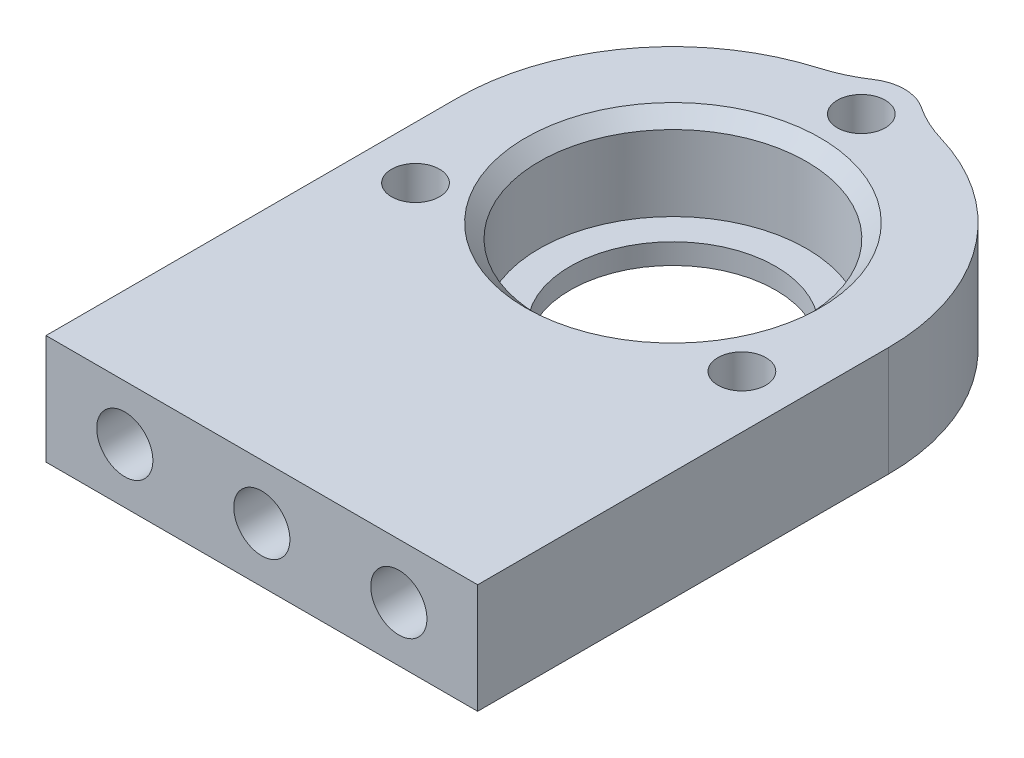
ISO-10303-21;
HEADER;
FILE_DESCRIPTION(('STEP AP214'),'2;1');
FILE_NAME('part.step','',(''),(''),'','','');
FILE_SCHEMA(('AUTOMOTIVE_DESIGN { 1 0 10303 214 1 1 1 1 }'));
ENDSEC;
DATA;
#1=APPLICATION_CONTEXT('core data for automotive mechanical design processes');
#2=APPLICATION_PROTOCOL_DEFINITION('international standard','automotive_design',2000,#1);
#3=PRODUCT_CONTEXT('',#1,'mechanical');
#4=PRODUCT('Part','Part','',(#3));
#5=PRODUCT_RELATED_PRODUCT_CATEGORY('part','',(#4));
#6=PRODUCT_DEFINITION_FORMATION('','',#4);
#7=PRODUCT_DEFINITION_CONTEXT('part definition',#1,'design');
#8=PRODUCT_DEFINITION('design','',#6,#7);
#9=PRODUCT_DEFINITION_SHAPE('','',#8);
#10=(LENGTH_UNIT() NAMED_UNIT(*) SI_UNIT(.MILLI.,.METRE.));
#11=(NAMED_UNIT(*) PLANE_ANGLE_UNIT() SI_UNIT($,.RADIAN.));
#12=(NAMED_UNIT(*) SI_UNIT($,.STERADIAN.) SOLID_ANGLE_UNIT());
#13=UNCERTAINTY_MEASURE_WITH_UNIT(LENGTH_MEASURE(1.E-05),#10,'distance_accuracy_value','');
#14=(GEOMETRIC_REPRESENTATION_CONTEXT(3) GLOBAL_UNCERTAINTY_ASSIGNED_CONTEXT((#13)) GLOBAL_UNIT_ASSIGNED_CONTEXT((#10,
#11,#12)) REPRESENTATION_CONTEXT('',''));
#15=CARTESIAN_POINT('',(0.,0.,0.));
#16=DIRECTION('',(0.,0.,1.));
#17=DIRECTION('',(1.,0.,0.));
#18=AXIS2_PLACEMENT_3D('',#15,#16,#17);
#19=CARTESIAN_POINT('',(0.,8.,-30.));
#20=DIRECTION('',(0.,-1.,0.));
#21=DIRECTION('',(0.,0.,-1.));
#22=AXIS2_PLACEMENT_3D('',#19,#20,#21);
#23=CYLINDRICAL_SURFACE('',#22,15.75);
#24=CARTESIAN_POINT('',(0.,0.,-30.));
#25=DIRECTION('',(0.,1.,0.));
#26=DIRECTION('',(0.,0.,1.));
#27=AXIS2_PLACEMENT_3D('',#24,#25,#26);
#28=CIRCLE('',#27,15.75);
#29=CARTESIAN_POINT('',(15.75,0.,-30.));
#30=VERTEX_POINT('',#29);
#31=CARTESIAN_POINT('',(4.45531118731971,0.,-45.1067105030891));
#32=VERTEX_POINT('',#31);
#33=EDGE_CURVE('E218',#30,#32,#28,.T.);
#34=ORIENTED_EDGE('',*,*,#33,.T.);
#35=DIRECTION('',(0.,-1.,0.));
#36=VECTOR('',#35,1.);
#37=CARTESIAN_POINT('',(4.45531118731971,8.,-45.1067105030891));
#38=LINE('',#37,#36);
#39=CARTESIAN_POINT('',(4.45531118731971,8.,-45.1067105030891));
#40=VERTEX_POINT('',#39);
#41=EDGE_CURVE('E121',#32,#40,#38,.F.);
#42=ORIENTED_EDGE('',*,*,#41,.T.);
#43=CARTESIAN_POINT('',(0.,8.,-30.));
#44=DIRECTION('',(0.,1.,0.));
#45=DIRECTION('',(0.,0.,1.));
#46=AXIS2_PLACEMENT_3D('',#43,#44,#45);
#47=CIRCLE('',#46,15.75);
#48=CARTESIAN_POINT('',(15.75,8.,-30.));
#49=VERTEX_POINT('',#48);
#50=EDGE_CURVE('E106',#49,#40,#47,.T.);
#51=ORIENTED_EDGE('',*,*,#50,.F.);
#52=DIRECTION('',(0.,-1.,0.));
#53=VECTOR('',#52,1.);
#54=CARTESIAN_POINT('',(15.75,8.,-30.));
#55=LINE('',#54,#53);
#56=EDGE_CURVE('E217',#49,#30,#55,.T.);
#57=ORIENTED_EDGE('',*,*,#56,.T.);
#58=EDGE_LOOP('',(#34,#42,#51,#57));
#59=FACE_BOUND('',#58,.T.);
#60=ADVANCED_FACE('F37',(#59),#23,.T.);
#61=CARTESIAN_POINT('',(0.,8.,-30.));
#62=DIRECTION('',(0.,-1.,0.));
#63=DIRECTION('',(0.,0.,-1.));
#64=AXIS2_PLACEMENT_3D('',#61,#62,#63);
#65=CYLINDRICAL_SURFACE('',#64,9.75);
#66=CARTESIAN_POINT('',(0.,6.99999999999997,-30.));
#67=DIRECTION('',(0.,1.,0.));
#68=DIRECTION('',(0.,0.,1.));
#69=AXIS2_PLACEMENT_3D('',#66,#67,#68);
#70=CIRCLE('',#69,9.75);
#71=CARTESIAN_POINT('',(0.,6.99999999999997,-20.25));
#72=VERTEX_POINT('',#71);
#73=EDGE_CURVE('E45',#72,#72,#70,.T.);
#74=ORIENTED_EDGE('',*,*,#73,.T.);
#75=EDGE_LOOP('',(#74));
#76=FACE_BOUND('',#75,.T.);
#77=CARTESIAN_POINT('',(0.,1.5,-30.));
#78=DIRECTION('',(0.,-1.,0.));
#79=DIRECTION('',(0.,0.,-1.));
#80=AXIS2_PLACEMENT_3D('',#77,#78,#79);
#81=CIRCLE('',#80,9.75);
#82=CARTESIAN_POINT('',(0.,1.5,-39.75));
#83=VERTEX_POINT('',#82);
#84=EDGE_CURVE('E251',#83,#83,#81,.T.);
#85=ORIENTED_EDGE('',*,*,#84,.T.);
#86=EDGE_LOOP('',(#85));
#87=FACE_BOUND('',#86,.T.);
#88=ADVANCED_FACE('F144',(#76,#87),#65,.F.);
#89=CARTESIAN_POINT('',(0.,8.,-30.));
#90=DIRECTION('',(0.,1.,0.));
#91=DIRECTION('',(0.,0.,1.));
#92=AXIS2_PLACEMENT_3D('',#89,#90,#91);
#93=PLANE('',#92);
#94=CARTESIAN_POINT('',(0.,8.,-30.));
#95=DIRECTION('',(0.,1.,0.));
#96=DIRECTION('',(0.,0.,1.));
#97=AXIS2_PLACEMENT_3D('',#94,#95,#96);
#98=CIRCLE('',#97,10.75);
#99=CARTESIAN_POINT('',(0.,8.,-19.25));
#100=VERTEX_POINT('',#99);
#101=EDGE_CURVE('E11',#100,#100,#98,.F.);
#102=ORIENTED_EDGE('',*,*,#101,.T.);
#103=EDGE_LOOP('',(#102));
#104=FACE_BOUND('',#103,.T.);
#105=CARTESIAN_POINT('',(0.,8.,-43.75));
#106=DIRECTION('',(0.,1.,0.));
#107=DIRECTION('',(0.,0.,1.));
#108=AXIS2_PLACEMENT_3D('',#105,#106,#107);
#109=CIRCLE('',#108,1.75);
#110=CARTESIAN_POINT('',(0.,8.,-42.));
#111=VERTEX_POINT('',#110);
#112=EDGE_CURVE('E242',#111,#111,#109,.T.);
#113=ORIENTED_EDGE('',*,*,#112,.F.);
#114=EDGE_LOOP('',(#113));
#115=FACE_BOUND('',#114,.T.);
#116=CARTESIAN_POINT('',(11.9078493020366,8.,-23.1250000000003));
#117=DIRECTION('',(0.,1.,0.));
#118=DIRECTION('',(0.,0.,1.));
#119=AXIS2_PLACEMENT_3D('',#116,#117,#118);
#120=CIRCLE('',#119,1.75);
#121=CARTESIAN_POINT('',(11.9078493020366,8.,-21.3750000000003));
#122=VERTEX_POINT('',#121);
#123=EDGE_CURVE('E498',#122,#122,#120,.T.);
#124=ORIENTED_EDGE('',*,*,#123,.F.);
#125=EDGE_LOOP('',(#124));
#126=FACE_BOUND('',#125,.T.);
#127=CARTESIAN_POINT('',(-11.9078493020355,8.,-23.1249999999998));
#128=DIRECTION('',(0.,1.,0.));
#129=DIRECTION('',(0.,0.,1.));
#130=AXIS2_PLACEMENT_3D('',#127,#128,#129);
#131=CIRCLE('',#130,1.75);
#132=CARTESIAN_POINT('',(-11.9078493020355,8.,-21.3749999999998));
#133=VERTEX_POINT('',#132);
#134=EDGE_CURVE('E245',#133,#133,#131,.T.);
#135=ORIENTED_EDGE('',*,*,#134,.F.);
#136=EDGE_LOOP('',(#135));
#137=FACE_BOUND('',#136,.T.);
#138=ORIENTED_EDGE('',*,*,#50,.T.);
#139=CARTESIAN_POINT('',(7.28408019514175,8.,-54.6982727272727));
#140=DIRECTION('',(0.,1.,0.));
#141=DIRECTION('',(0.,0.,1.));
#142=AXIS2_PLACEMENT_3D('',#139,#140,#141);
#143=CIRCLE('',#142,10.);
#144=CARTESIAN_POINT('',(1.74485571214422,8.,-46.372590044936));
#145=VERTEX_POINT('',#144);
#146=EDGE_CURVE('E135',#40,#145,#143,.F.);
#147=ORIENTED_EDGE('',*,*,#146,.T.);
#148=CARTESIAN_POINT('',(0.,8.,-43.75));
#149=DIRECTION('',(0.,1.,0.));
#150=DIRECTION('',(0.,0.,1.));
#151=AXIS2_PLACEMENT_3D('',#148,#149,#150);
#152=CIRCLE('',#151,3.15);
#153=CARTESIAN_POINT('',(-1.74485571214422,8.,-46.372590044936));
#154=VERTEX_POINT('',#153);
#155=EDGE_CURVE('E234',#145,#154,#152,.T.);
#156=ORIENTED_EDGE('',*,*,#155,.T.);
#157=CARTESIAN_POINT('',(-7.28408019514175,8.,-54.6982727272727));
#158=DIRECTION('',(0.,1.,0.));
#159=DIRECTION('',(0.,0.,1.));
#160=AXIS2_PLACEMENT_3D('',#157,#158,#159);
#161=CIRCLE('',#160,10.);
#162=CARTESIAN_POINT('',(-4.45531118731971,8.,-45.1067105030891));
#163=VERTEX_POINT('',#162);
#164=EDGE_CURVE('E60',#154,#163,#161,.F.);
#165=ORIENTED_EDGE('',*,*,#164,.T.);
#166=CARTESIAN_POINT('',(-15.75,8.,-30.));
#167=VERTEX_POINT('',#166);
#168=EDGE_CURVE('E99',#163,#167,#47,.T.);
#169=ORIENTED_EDGE('',*,*,#168,.T.);
#170=DIRECTION('',(0.,0.,1.));
#171=VECTOR('',#170,1.);
#172=CARTESIAN_POINT('',(-15.75,8.,0.));
#173=LINE('',#172,#171);
#174=CARTESIAN_POINT('',(-15.75,8.,0.));
#175=VERTEX_POINT('',#174);
#176=EDGE_CURVE('E103',#167,#175,#173,.T.);
#177=ORIENTED_EDGE('',*,*,#176,.T.);
#178=DIRECTION('',(1.,0.,0.));
#179=VECTOR('',#178,1.);
#180=CARTESIAN_POINT('',(-15.75,8.,0.));
#181=LINE('',#180,#179);
#182=CARTESIAN_POINT('',(15.75,8.,0.));
#183=VERTEX_POINT('',#182);
#184=EDGE_CURVE('E116',#175,#183,#181,.T.);
#185=ORIENTED_EDGE('',*,*,#184,.T.);
#186=DIRECTION('',(0.,0.,-1.));
#187=VECTOR('',#186,1.);
#188=CARTESIAN_POINT('',(15.75,8.,0.));
#189=LINE('',#188,#187);
#190=EDGE_CURVE('E216',#183,#49,#189,.T.);
#191=ORIENTED_EDGE('',*,*,#190,.T.);
#192=EDGE_LOOP('',(#138,#147,#156,#165,#169,#177,#185,#191));
#193=FACE_BOUND('',#192,.T.);
#194=ADVANCED_FACE('F102',(#104,#115,#126,#137,#193),#93,.T.);
#195=CARTESIAN_POINT('',(0.,0.,-30.));
#196=DIRECTION('',(0.,1.,0.));
#197=DIRECTION('',(0.,0.,1.));
#198=AXIS2_PLACEMENT_3D('',#195,#196,#197);
#199=PLANE('',#198);
#200=ORIENTED_EDGE('',*,*,#33,.F.);
#201=DIRECTION('',(0.,0.,-1.));
#202=VECTOR('',#201,1.);
#203=CARTESIAN_POINT('',(15.75,0.,0.));
#204=LINE('',#203,#202);
#205=CARTESIAN_POINT('',(15.75,0.,0.));
#206=VERTEX_POINT('',#205);
#207=EDGE_CURVE('E107',#206,#30,#204,.T.);
#208=ORIENTED_EDGE('',*,*,#207,.F.);
#209=DIRECTION('',(1.,0.,0.));
#210=VECTOR('',#209,1.);
#211=CARTESIAN_POINT('',(-15.75,0.,0.));
#212=LINE('',#211,#210);
#213=CARTESIAN_POINT('',(-15.75,0.,0.));
#214=VERTEX_POINT('',#213);
#215=EDGE_CURVE('E208',#214,#206,#212,.T.);
#216=ORIENTED_EDGE('',*,*,#215,.F.);
#217=DIRECTION('',(0.,0.,1.));
#218=VECTOR('',#217,1.);
#219=CARTESIAN_POINT('',(-15.75,0.,0.));
#220=LINE('',#219,#218);
#221=CARTESIAN_POINT('',(-15.75,0.,-30.));
#222=VERTEX_POINT('',#221);
#223=EDGE_CURVE('E212',#222,#214,#220,.T.);
#224=ORIENTED_EDGE('',*,*,#223,.F.);
#225=CARTESIAN_POINT('',(-4.45531118731971,0.,-45.1067105030891));
#226=VERTEX_POINT('',#225);
#227=EDGE_CURVE('E119',#226,#222,#28,.T.);
#228=ORIENTED_EDGE('',*,*,#227,.F.);
#229=CARTESIAN_POINT('',(-7.28408019514175,0.,-54.6982727272727));
#230=DIRECTION('',(0.,1.,0.));
#231=DIRECTION('',(0.,0.,1.));
#232=AXIS2_PLACEMENT_3D('',#229,#230,#231);
#233=CIRCLE('',#232,10.);
#234=CARTESIAN_POINT('',(-1.74485571214422,0.,-46.372590044936));
#235=VERTEX_POINT('',#234);
#236=EDGE_CURVE('E140',#226,#235,#233,.T.);
#237=ORIENTED_EDGE('',*,*,#236,.T.);
#238=CARTESIAN_POINT('',(0.,0.,-43.75));
#239=DIRECTION('',(0.,1.,0.));
#240=DIRECTION('',(0.,0.,1.));
#241=AXIS2_PLACEMENT_3D('',#238,#239,#240);
#242=CIRCLE('',#241,3.15);
#243=CARTESIAN_POINT('',(1.74485571214422,0.,-46.372590044936));
#244=VERTEX_POINT('',#243);
#245=EDGE_CURVE('E236',#235,#244,#242,.F.);
#246=ORIENTED_EDGE('',*,*,#245,.T.);
#247=CARTESIAN_POINT('',(7.28408019514175,0.,-54.6982727272727));
#248=DIRECTION('',(0.,1.,0.));
#249=DIRECTION('',(0.,0.,1.));
#250=AXIS2_PLACEMENT_3D('',#247,#248,#249);
#251=CIRCLE('',#250,10.);
#252=EDGE_CURVE('E137',#244,#32,#251,.T.);
#253=ORIENTED_EDGE('',*,*,#252,.T.);
#254=EDGE_LOOP('',(#200,#208,#216,#224,#228,#237,#246,#253));
#255=FACE_BOUND('',#254,.T.);
#256=CARTESIAN_POINT('',(0.,0.,-30.));
#257=DIRECTION('',(0.,-1.,0.));
#258=DIRECTION('',(0.,0.,-1.));
#259=AXIS2_PLACEMENT_3D('',#256,#257,#258);
#260=CIRCLE('',#259,7.5);
#261=CARTESIAN_POINT('',(0.,0.,-37.5));
#262=VERTEX_POINT('',#261);
#263=EDGE_CURVE('E239',#262,#262,#260,.T.);
#264=ORIENTED_EDGE('',*,*,#263,.F.);
#265=EDGE_LOOP('',(#264));
#266=FACE_BOUND('',#265,.T.);
#267=ADVANCED_FACE('F169',(#255,#266),#199,.F.);
#268=ORIENTED_EDGE('',*,*,#168,.F.);
#269=DIRECTION('',(0.,-1.,0.));
#270=VECTOR('',#269,1.);
#271=CARTESIAN_POINT('',(-4.45531118731971,8.,-45.1067105030891));
#272=LINE('',#271,#270);
#273=EDGE_CURVE('E52',#163,#226,#272,.T.);
#274=ORIENTED_EDGE('',*,*,#273,.T.);
#275=ORIENTED_EDGE('',*,*,#227,.T.);
#276=DIRECTION('',(0.,-1.,0.));
#277=VECTOR('',#276,1.);
#278=CARTESIAN_POINT('',(-15.75,8.,-30.));
#279=LINE('',#278,#277);
#280=EDGE_CURVE('E112',#167,#222,#279,.T.);
#281=ORIENTED_EDGE('',*,*,#280,.F.);
#282=EDGE_LOOP('',(#268,#274,#275,#281));
#283=FACE_BOUND('',#282,.T.);
#284=ADVANCED_FACE('F118',(#283),#23,.T.);
#285=CARTESIAN_POINT('',(-15.75,8.,0.));
#286=DIRECTION('',(1.,0.,0.));
#287=DIRECTION('',(0.,0.,-1.));
#288=AXIS2_PLACEMENT_3D('',#285,#286,#287);
#289=PLANE('',#288);
#290=ORIENTED_EDGE('',*,*,#223,.T.);
#291=DIRECTION('',(0.,-1.,0.));
#292=VECTOR('',#291,1.);
#293=CARTESIAN_POINT('',(-15.75,8.,0.));
#294=LINE('',#293,#292);
#295=EDGE_CURVE('E114',#175,#214,#294,.T.);
#296=ORIENTED_EDGE('',*,*,#295,.F.);
#297=ORIENTED_EDGE('',*,*,#176,.F.);
#298=ORIENTED_EDGE('',*,*,#280,.T.);
#299=EDGE_LOOP('',(#290,#296,#297,#298));
#300=FACE_BOUND('',#299,.T.);
#301=ADVANCED_FACE('F111',(#300),#289,.F.);
#302=CARTESIAN_POINT('',(-15.75,8.,0.));
#303=DIRECTION('',(0.,0.,-1.));
#304=DIRECTION('',(-1.,0.,0.));
#305=AXIS2_PLACEMENT_3D('',#302,#303,#304);
#306=PLANE('',#305);
#307=CARTESIAN_POINT('',(10.,4.,0.));
#308=DIRECTION('',(0.,0.,1.));
#309=DIRECTION('',(-1.,0.,0.));
#310=AXIS2_PLACEMENT_3D('',#307,#308,#309);
#311=CIRCLE('',#310,2.05);
#312=CARTESIAN_POINT('',(7.95,4.,0.));
#313=VERTEX_POINT('',#312);
#314=EDGE_CURVE('E197',#313,#313,#311,.T.);
#315=ORIENTED_EDGE('',*,*,#314,.F.);
#316=EDGE_LOOP('',(#315));
#317=FACE_BOUND('',#316,.T.);
#318=CARTESIAN_POINT('',(-10.,4.,0.));
#319=DIRECTION('',(0.,0.,1.));
#320=DIRECTION('',(1.,0.,0.));
#321=AXIS2_PLACEMENT_3D('',#318,#319,#320);
#322=CIRCLE('',#321,2.05);
#323=CARTESIAN_POINT('',(-7.95,4.,0.));
#324=VERTEX_POINT('',#323);
#325=EDGE_CURVE('E201',#324,#324,#322,.T.);
#326=ORIENTED_EDGE('',*,*,#325,.F.);
#327=EDGE_LOOP('',(#326));
#328=FACE_BOUND('',#327,.T.);
#329=CARTESIAN_POINT('',(0.,4.,0.));
#330=DIRECTION('',(0.,0.,1.));
#331=DIRECTION('',(1.,0.,0.));
#332=AXIS2_PLACEMENT_3D('',#329,#330,#331);
#333=CIRCLE('',#332,2.05);
#334=CARTESIAN_POINT('',(2.05,4.,0.));
#335=VERTEX_POINT('',#334);
#336=EDGE_CURVE('E205',#335,#335,#333,.T.);
#337=ORIENTED_EDGE('',*,*,#336,.F.);
#338=EDGE_LOOP('',(#337));
#339=FACE_BOUND('',#338,.T.);
#340=ORIENTED_EDGE('',*,*,#215,.T.);
#341=DIRECTION('',(0.,-1.,0.));
#342=VECTOR('',#341,1.);
#343=CARTESIAN_POINT('',(15.75,8.,0.));
#344=LINE('',#343,#342);
#345=EDGE_CURVE('E126',#183,#206,#344,.T.);
#346=ORIENTED_EDGE('',*,*,#345,.F.);
#347=ORIENTED_EDGE('',*,*,#184,.F.);
#348=ORIENTED_EDGE('',*,*,#295,.T.);
#349=EDGE_LOOP('',(#340,#346,#347,#348));
#350=FACE_BOUND('',#349,.T.);
#351=ADVANCED_FACE('F174',(#317,#328,#339,#350),#306,.F.);
#352=CARTESIAN_POINT('',(15.75,8.,0.));
#353=DIRECTION('',(-1.,0.,0.));
#354=DIRECTION('',(0.,0.,1.));
#355=AXIS2_PLACEMENT_3D('',#352,#353,#354);
#356=PLANE('',#355);
#357=ORIENTED_EDGE('',*,*,#207,.T.);
#358=ORIENTED_EDGE('',*,*,#56,.F.);
#359=ORIENTED_EDGE('',*,*,#190,.F.);
#360=ORIENTED_EDGE('',*,*,#345,.T.);
#361=EDGE_LOOP('',(#357,#358,#359,#360));
#362=FACE_BOUND('',#361,.T.);
#363=ADVANCED_FACE('F185',(#362),#356,.F.);
#364=CARTESIAN_POINT('',(0.,4.,-6.));
#365=DIRECTION('',(0.,0.,1.));
#366=DIRECTION('',(1.,0.,0.));
#367=AXIS2_PLACEMENT_3D('',#364,#365,#366);
#368=CYLINDRICAL_SURFACE('',#367,2.05);
#369=CARTESIAN_POINT('',(0.,4.,-6.));
#370=DIRECTION('',(0.,0.,1.));
#371=DIRECTION('',(1.,0.,0.));
#372=AXIS2_PLACEMENT_3D('',#369,#370,#371);
#373=CIRCLE('',#372,2.05);
#374=CARTESIAN_POINT('',(2.05,4.,-6.));
#375=VERTEX_POINT('',#374);
#376=EDGE_CURVE('E229',#375,#375,#373,.T.);
#377=ORIENTED_EDGE('',*,*,#376,.F.);
#378=EDGE_LOOP('',(#377));
#379=FACE_BOUND('',#378,.T.);
#380=ORIENTED_EDGE('',*,*,#336,.T.);
#381=EDGE_LOOP('',(#380));
#382=FACE_BOUND('',#381,.T.);
#383=ADVANCED_FACE('F188',(#379,#382),#368,.F.);
#384=CARTESIAN_POINT('',(0.,4.,-6.));
#385=DIRECTION('',(0.,0.,1.));
#386=DIRECTION('',(1.,0.,0.));
#387=AXIS2_PLACEMENT_3D('',#384,#385,#386);
#388=PLANE('',#387);
#389=ORIENTED_EDGE('',*,*,#376,.T.);
#390=EDGE_LOOP('',(#389));
#391=FACE_BOUND('',#390,.T.);
#392=ADVANCED_FACE('F316',(#391),#388,.T.);
#393=CARTESIAN_POINT('',(-10.,4.,-6.));
#394=DIRECTION('',(0.,0.,1.));
#395=DIRECTION('',(1.,0.,0.));
#396=AXIS2_PLACEMENT_3D('',#393,#394,#395);
#397=CYLINDRICAL_SURFACE('',#396,2.05);
#398=CARTESIAN_POINT('',(-10.,4.,-6.));
#399=DIRECTION('',(0.,0.,1.));
#400=DIRECTION('',(1.,0.,0.));
#401=AXIS2_PLACEMENT_3D('',#398,#399,#400);
#402=CIRCLE('',#401,2.05);
#403=CARTESIAN_POINT('',(-7.95,4.,-6.));
#404=VERTEX_POINT('',#403);
#405=EDGE_CURVE('E256',#404,#404,#402,.T.);
#406=ORIENTED_EDGE('',*,*,#405,.F.);
#407=EDGE_LOOP('',(#406));
#408=FACE_BOUND('',#407,.T.);
#409=ORIENTED_EDGE('',*,*,#325,.T.);
#410=EDGE_LOOP('',(#409));
#411=FACE_BOUND('',#410,.T.);
#412=ADVANCED_FACE('F312',(#408,#411),#397,.F.);
#413=CARTESIAN_POINT('',(-10.,4.,-6.));
#414=DIRECTION('',(0.,0.,1.));
#415=DIRECTION('',(1.,0.,0.));
#416=AXIS2_PLACEMENT_3D('',#413,#414,#415);
#417=PLANE('',#416);
#418=ORIENTED_EDGE('',*,*,#405,.T.);
#419=EDGE_LOOP('',(#418));
#420=FACE_BOUND('',#419,.T.);
#421=ADVANCED_FACE('F308',(#420),#417,.T.);
#422=CARTESIAN_POINT('',(10.,4.,-6.));
#423=DIRECTION('',(0.,0.,1.));
#424=DIRECTION('',(1.,0.,0.));
#425=AXIS2_PLACEMENT_3D('',#422,#423,#424);
#426=CYLINDRICAL_SURFACE('',#425,2.05);
#427=CARTESIAN_POINT('',(10.,4.,-6.));
#428=DIRECTION('',(0.,0.,1.));
#429=DIRECTION('',(-1.,0.,0.));
#430=AXIS2_PLACEMENT_3D('',#427,#428,#429);
#431=CIRCLE('',#430,2.05);
#432=CARTESIAN_POINT('',(7.95,4.,-6.));
#433=VERTEX_POINT('',#432);
#434=EDGE_CURVE('E260',#433,#433,#431,.T.);
#435=ORIENTED_EDGE('',*,*,#434,.F.);
#436=EDGE_LOOP('',(#435));
#437=FACE_BOUND('',#436,.T.);
#438=ORIENTED_EDGE('',*,*,#314,.T.);
#439=EDGE_LOOP('',(#438));
#440=FACE_BOUND('',#439,.T.);
#441=ADVANCED_FACE('F311',(#437,#440),#426,.F.);
#442=CARTESIAN_POINT('',(10.,4.,-6.));
#443=DIRECTION('',(0.,0.,-1.));
#444=DIRECTION('',(-1.,0.,0.));
#445=AXIS2_PLACEMENT_3D('',#442,#443,#444);
#446=PLANE('',#445);
#447=ORIENTED_EDGE('',*,*,#434,.T.);
#448=EDGE_LOOP('',(#447));
#449=FACE_BOUND('',#448,.T.);
#450=ADVANCED_FACE('F306',(#449),#446,.F.);
#451=CARTESIAN_POINT('',(0.,1.5,-30.));
#452=DIRECTION('',(0.,-1.,0.));
#453=DIRECTION('',(0.,0.,-1.));
#454=AXIS2_PLACEMENT_3D('',#451,#452,#453);
#455=PLANE('',#454);
#456=CARTESIAN_POINT('',(0.,1.5,-30.));
#457=DIRECTION('',(0.,-1.,0.));
#458=DIRECTION('',(0.,0.,-1.));
#459=AXIS2_PLACEMENT_3D('',#456,#457,#458);
#460=CIRCLE('',#459,7.5);
#461=CARTESIAN_POINT('',(0.,1.5,-37.5));
#462=VERTEX_POINT('',#461);
#463=EDGE_CURVE('E248',#462,#462,#460,.T.);
#464=ORIENTED_EDGE('',*,*,#463,.T.);
#465=EDGE_LOOP('',(#464));
#466=FACE_BOUND('',#465,.T.);
#467=ORIENTED_EDGE('',*,*,#84,.F.);
#468=EDGE_LOOP('',(#467));
#469=FACE_BOUND('',#468,.T.);
#470=ADVANCED_FACE('F302',(#466,#469),#455,.F.);
#471=CARTESIAN_POINT('',(0.,1.5,-30.));
#472=DIRECTION('',(0.,-1.,0.));
#473=DIRECTION('',(0.,0.,-1.));
#474=AXIS2_PLACEMENT_3D('',#471,#472,#473);
#475=CYLINDRICAL_SURFACE('',#474,7.5);
#476=ORIENTED_EDGE('',*,*,#463,.F.);
#477=EDGE_LOOP('',(#476));
#478=FACE_BOUND('',#477,.T.);
#479=ORIENTED_EDGE('',*,*,#263,.T.);
#480=EDGE_LOOP('',(#479));
#481=FACE_BOUND('',#480,.T.);
#482=ADVANCED_FACE('F299',(#478,#481),#475,.F.);
#483=CARTESIAN_POINT('',(0.,-5.36791487058534,-43.75));
#484=DIRECTION('',(0.,1.,0.));
#485=DIRECTION('',(0.,0.,1.));
#486=AXIS2_PLACEMENT_3D('',#483,#484,#485);
#487=CYLINDRICAL_SURFACE('',#486,3.15);
#488=ORIENTED_EDGE('',*,*,#155,.F.);
#489=DIRECTION('',(0.,1.,0.));
#490=VECTOR('',#489,1.);
#491=CARTESIAN_POINT('',(1.74485571214422,-5.36791487058534,-46.372590044936));
#492=LINE('',#491,#490);
#493=EDGE_CURVE('E132',#145,#244,#492,.F.);
#494=ORIENTED_EDGE('',*,*,#493,.T.);
#495=ORIENTED_EDGE('',*,*,#245,.F.);
#496=DIRECTION('',(0.,1.,0.));
#497=VECTOR('',#496,1.);
#498=CARTESIAN_POINT('',(-1.74485571214422,-5.36791487058534,-46.372590044936));
#499=LINE('',#498,#497);
#500=EDGE_CURVE('E124',#235,#154,#499,.T.);
#501=ORIENTED_EDGE('',*,*,#500,.T.);
#502=EDGE_LOOP('',(#488,#494,#495,#501));
#503=FACE_BOUND('',#502,.T.);
#504=ADVANCED_FACE('F233',(#503),#487,.T.);
#505=CARTESIAN_POINT('',(-11.9078493020355,4.,-23.1249999999998));
#506=DIRECTION('',(0.,1.,0.));
#507=DIRECTION('',(0.,0.,1.));
#508=AXIS2_PLACEMENT_3D('',#505,#506,#507);
#509=CYLINDRICAL_SURFACE('',#508,1.75);
#510=CARTESIAN_POINT('',(-11.9078493020355,4.,-23.1249999999998));
#511=DIRECTION('',(0.,1.,0.));
#512=DIRECTION('',(0.,0.,1.));
#513=AXIS2_PLACEMENT_3D('',#510,#511,#512);
#514=CIRCLE('',#513,1.75);
#515=CARTESIAN_POINT('',(-11.9078493020355,4.,-21.3749999999998));
#516=VERTEX_POINT('',#515);
#517=EDGE_CURVE('E494',#516,#516,#514,.T.);
#518=ORIENTED_EDGE('',*,*,#517,.F.);
#519=EDGE_LOOP('',(#518));
#520=FACE_BOUND('',#519,.T.);
#521=ORIENTED_EDGE('',*,*,#134,.T.);
#522=EDGE_LOOP('',(#521));
#523=FACE_BOUND('',#522,.T.);
#524=ADVANCED_FACE('F293',(#520,#523),#509,.F.);
#525=CARTESIAN_POINT('',(-11.9078493020355,4.,-23.1249999999998));
#526=DIRECTION('',(0.,1.,0.));
#527=DIRECTION('',(0.,0.,1.));
#528=AXIS2_PLACEMENT_3D('',#525,#526,#527);
#529=PLANE('',#528);
#530=ORIENTED_EDGE('',*,*,#517,.T.);
#531=EDGE_LOOP('',(#530));
#532=FACE_BOUND('',#531,.T.);
#533=ADVANCED_FACE('F289',(#532),#529,.T.);
#534=CARTESIAN_POINT('',(11.9078493020366,4.,-23.1250000000003));
#535=DIRECTION('',(0.,1.,0.));
#536=DIRECTION('',(0.,0.,1.));
#537=AXIS2_PLACEMENT_3D('',#534,#535,#536);
#538=CYLINDRICAL_SURFACE('',#537,1.75);
#539=CARTESIAN_POINT('',(11.9078493020366,4.,-23.1250000000003));
#540=DIRECTION('',(0.,1.,0.));
#541=DIRECTION('',(0.,0.,1.));
#542=AXIS2_PLACEMENT_3D('',#539,#540,#541);
#543=CIRCLE('',#542,1.75);
#544=CARTESIAN_POINT('',(11.9078493020366,4.,-21.3750000000003));
#545=VERTEX_POINT('',#544);
#546=EDGE_CURVE('E500',#545,#545,#543,.T.);
#547=ORIENTED_EDGE('',*,*,#546,.F.);
#548=EDGE_LOOP('',(#547));
#549=FACE_BOUND('',#548,.T.);
#550=ORIENTED_EDGE('',*,*,#123,.T.);
#551=EDGE_LOOP('',(#550));
#552=FACE_BOUND('',#551,.T.);
#553=ADVANCED_FACE('F285',(#549,#552),#538,.F.);
#554=CARTESIAN_POINT('',(11.9078493020366,4.,-23.1250000000003));
#555=DIRECTION('',(0.,1.,0.));
#556=DIRECTION('',(0.,0.,1.));
#557=AXIS2_PLACEMENT_3D('',#554,#555,#556);
#558=PLANE('',#557);
#559=ORIENTED_EDGE('',*,*,#546,.T.);
#560=EDGE_LOOP('',(#559));
#561=FACE_BOUND('',#560,.T.);
#562=ADVANCED_FACE('F279',(#561),#558,.T.);
#563=CARTESIAN_POINT('',(0.,4.,-43.75));
#564=DIRECTION('',(0.,1.,0.));
#565=DIRECTION('',(0.,0.,1.));
#566=AXIS2_PLACEMENT_3D('',#563,#564,#565);
#567=CYLINDRICAL_SURFACE('',#566,1.75);
#568=CARTESIAN_POINT('',(0.,4.,-43.75));
#569=DIRECTION('',(0.,1.,0.));
#570=DIRECTION('',(0.,0.,1.));
#571=AXIS2_PLACEMENT_3D('',#568,#569,#570);
#572=CIRCLE('',#571,1.75);
#573=CARTESIAN_POINT('',(0.,4.,-42.));
#574=VERTEX_POINT('',#573);
#575=EDGE_CURVE('E237',#574,#574,#572,.T.);
#576=ORIENTED_EDGE('',*,*,#575,.F.);
#577=EDGE_LOOP('',(#576));
#578=FACE_BOUND('',#577,.T.);
#579=ORIENTED_EDGE('',*,*,#112,.T.);
#580=EDGE_LOOP('',(#579));
#581=FACE_BOUND('',#580,.T.);
#582=ADVANCED_FACE('F274',(#578,#581),#567,.F.);
#583=CARTESIAN_POINT('',(0.,4.,-43.75));
#584=DIRECTION('',(0.,1.,0.));
#585=DIRECTION('',(0.,0.,1.));
#586=AXIS2_PLACEMENT_3D('',#583,#584,#585);
#587=PLANE('',#586);
#588=ORIENTED_EDGE('',*,*,#575,.T.);
#589=EDGE_LOOP('',(#588));
#590=FACE_BOUND('',#589,.T.);
#591=ADVANCED_FACE('F270',(#590),#587,.T.);
#592=CARTESIAN_POINT('',(7.28408019514175,-5.36791487058534,-54.6982727272727));
#593=DIRECTION('',(0.,-1.,0.));
#594=DIRECTION('',(0.,0.,-1.));
#595=AXIS2_PLACEMENT_3D('',#592,#593,#594);
#596=CYLINDRICAL_SURFACE('',#595,10.);
#597=ORIENTED_EDGE('',*,*,#252,.F.);
#598=ORIENTED_EDGE('',*,*,#493,.F.);
#599=ORIENTED_EDGE('',*,*,#146,.F.);
#600=ORIENTED_EDGE('',*,*,#41,.F.);
#601=EDGE_LOOP('',(#597,#598,#599,#600));
#602=FACE_BOUND('',#601,.T.);
#603=ADVANCED_FACE('F153',(#602),#596,.F.);
#604=CARTESIAN_POINT('',(-7.28408019514175,8.,-54.6982727272727));
#605=DIRECTION('',(0.,-1.,0.));
#606=DIRECTION('',(0.,0.,-1.));
#607=AXIS2_PLACEMENT_3D('',#604,#605,#606);
#608=CYLINDRICAL_SURFACE('',#607,10.);
#609=ORIENTED_EDGE('',*,*,#236,.F.);
#610=ORIENTED_EDGE('',*,*,#273,.F.);
#611=ORIENTED_EDGE('',*,*,#164,.F.);
#612=ORIENTED_EDGE('',*,*,#500,.F.);
#613=EDGE_LOOP('',(#609,#610,#611,#612));
#614=FACE_BOUND('',#613,.T.);
#615=ADVANCED_FACE('F148',(#614),#608,.F.);
#616=CARTESIAN_POINT('',(0.,6.99999999999997,-30.));
#617=DIRECTION('',(0.,1.,0.));
#618=DIRECTION('',(0.,0.,1.));
#619=AXIS2_PLACEMENT_3D('',#616,#617,#618);
#620=CONICAL_SURFACE('',#619,9.75,0.785398163397449);
#621=ORIENTED_EDGE('',*,*,#101,.F.);
#622=EDGE_LOOP('',(#621));
#623=FACE_BOUND('',#622,.T.);
#624=ORIENTED_EDGE('',*,*,#73,.F.);
#625=EDGE_LOOP('',(#624));
#626=FACE_BOUND('',#625,.T.);
#627=ADVANCED_FACE('F39',(#623,#626),#620,.F.);
#628=CLOSED_SHELL('',(#60,#88,#194,#267,#284,#301,#351,#363,#383,#392,#412,#421,#441,#450,#470,
#482,#504,#524,#533,#553,#562,#582,#591,#603,#615,#627));
#629=MANIFOLD_SOLID_BREP('B2',#628);
#630=ADVANCED_BREP_SHAPE_REPRESENTATION('',(#18,#629),#14);
#631=SHAPE_DEFINITION_REPRESENTATION(#9,#630);
ENDSEC;
END-ISO-10303-21;
